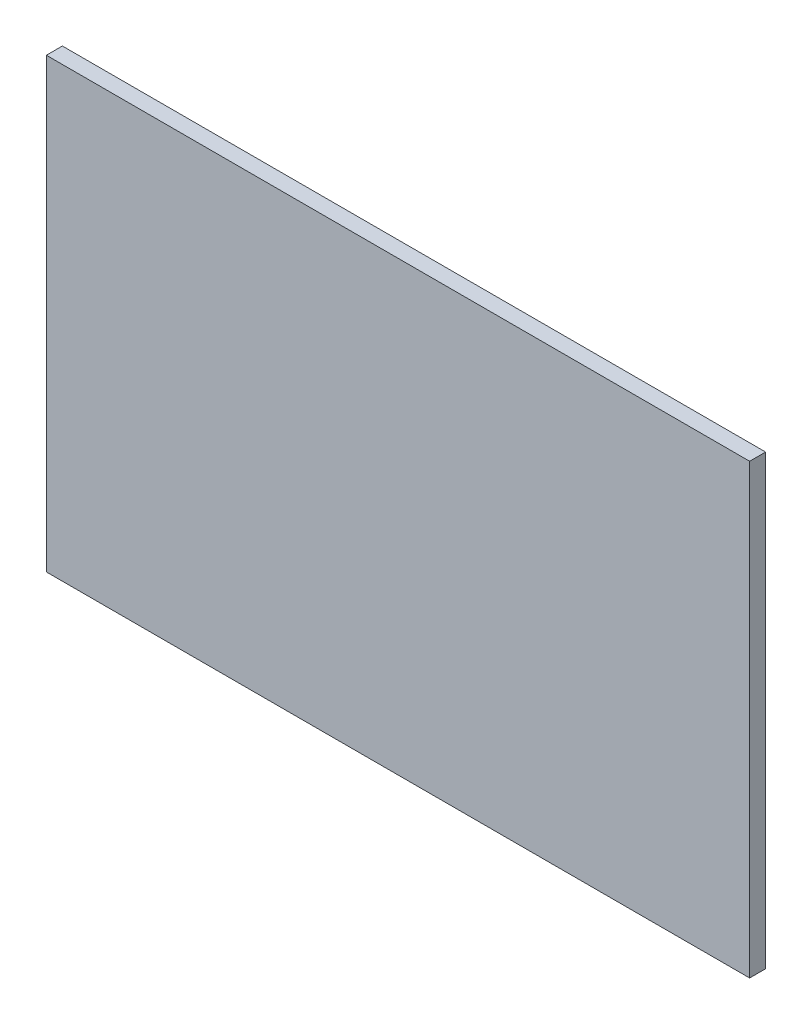
ISO-10303-21;
HEADER;
FILE_DESCRIPTION(('STEP AP214'),'2;1');
FILE_NAME('part.step','',(''),(''),'','','');
FILE_SCHEMA(('AUTOMOTIVE_DESIGN { 1 0 10303 214 1 1 1 1 }'));
ENDSEC;
DATA;
#1=APPLICATION_CONTEXT('core data for automotive mechanical design processes');
#2=APPLICATION_PROTOCOL_DEFINITION('international standard','automotive_design',2000,#1);
#3=PRODUCT_CONTEXT('',#1,'mechanical');
#4=PRODUCT('Part','Part','',(#3));
#5=PRODUCT_RELATED_PRODUCT_CATEGORY('part','',(#4));
#6=PRODUCT_DEFINITION_FORMATION('','',#4);
#7=PRODUCT_DEFINITION_CONTEXT('part definition',#1,'design');
#8=PRODUCT_DEFINITION('design','',#6,#7);
#9=PRODUCT_DEFINITION_SHAPE('','',#8);
#10=(LENGTH_UNIT() NAMED_UNIT(*) SI_UNIT(.MILLI.,.METRE.));
#11=(NAMED_UNIT(*) PLANE_ANGLE_UNIT() SI_UNIT($,.RADIAN.));
#12=(NAMED_UNIT(*) SI_UNIT($,.STERADIAN.) SOLID_ANGLE_UNIT());
#13=UNCERTAINTY_MEASURE_WITH_UNIT(LENGTH_MEASURE(1.E-05),#10,'distance_accuracy_value','');
#14=(GEOMETRIC_REPRESENTATION_CONTEXT(3) GLOBAL_UNCERTAINTY_ASSIGNED_CONTEXT((#13)) GLOBAL_UNIT_ASSIGNED_CONTEXT((#10,
#11,#12)) REPRESENTATION_CONTEXT('',''));
#15=CARTESIAN_POINT('',(0.,0.,0.));
#16=DIRECTION('',(0.,0.,1.));
#17=DIRECTION('',(1.,0.,0.));
#18=AXIS2_PLACEMENT_3D('',#15,#16,#17);
#19=CARTESIAN_POINT('',(110.,70.,5.));
#20=DIRECTION('',(-1.,0.,0.));
#21=DIRECTION('',(0.,0.,1.));
#22=AXIS2_PLACEMENT_3D('',#19,#20,#21);
#23=PLANE('',#22);
#24=DIRECTION('',(0.,1.,0.));
#25=VECTOR('',#24,1.);
#26=CARTESIAN_POINT('',(110.,70.,0.));
#27=LINE('',#26,#25);
#28=CARTESIAN_POINT('',(110.,-70.,0.));
#29=VERTEX_POINT('',#28);
#30=CARTESIAN_POINT('',(110.,70.,0.));
#31=VERTEX_POINT('',#30);
#32=EDGE_CURVE('E98',#29,#31,#27,.T.);
#33=ORIENTED_EDGE('',*,*,#32,.T.);
#34=DIRECTION('',(0.,0.,-1.));
#35=VECTOR('',#34,1.);
#36=CARTESIAN_POINT('',(110.,70.,5.));
#37=LINE('',#36,#35);
#38=CARTESIAN_POINT('',(110.,70.,5.));
#39=VERTEX_POINT('',#38);
#40=EDGE_CURVE('E11',#39,#31,#37,.T.);
#41=ORIENTED_EDGE('',*,*,#40,.F.);
#42=DIRECTION('',(0.,1.,0.));
#43=VECTOR('',#42,1.);
#44=CARTESIAN_POINT('',(110.,70.,5.));
#45=LINE('',#44,#43);
#46=CARTESIAN_POINT('',(110.,-70.,5.));
#47=VERTEX_POINT('',#46);
#48=EDGE_CURVE('E86',#47,#39,#45,.T.);
#49=ORIENTED_EDGE('',*,*,#48,.F.);
#50=DIRECTION('',(0.,0.,-1.));
#51=VECTOR('',#50,1.);
#52=CARTESIAN_POINT('',(110.,-70.,5.));
#53=LINE('',#52,#51);
#54=EDGE_CURVE('E94',#47,#29,#53,.T.);
#55=ORIENTED_EDGE('',*,*,#54,.T.);
#56=EDGE_LOOP('',(#33,#41,#49,#55));
#57=FACE_BOUND('',#56,.T.);
#58=ADVANCED_FACE('F35',(#57),#23,.F.);
#59=CARTESIAN_POINT('',(-110.,70.,5.));
#60=DIRECTION('',(0.,-1.,0.));
#61=DIRECTION('',(0.,0.,-1.));
#62=AXIS2_PLACEMENT_3D('',#59,#60,#61);
#63=PLANE('',#62);
#64=DIRECTION('',(-1.,0.,0.));
#65=VECTOR('',#64,1.);
#66=CARTESIAN_POINT('',(-110.,70.,0.));
#67=LINE('',#66,#65);
#68=CARTESIAN_POINT('',(-110.,70.,0.));
#69=VERTEX_POINT('',#68);
#70=EDGE_CURVE('E90',#31,#69,#67,.T.);
#71=ORIENTED_EDGE('',*,*,#70,.T.);
#72=DIRECTION('',(0.,0.,-1.));
#73=VECTOR('',#72,1.);
#74=CARTESIAN_POINT('',(-110.,70.,5.));
#75=LINE('',#74,#73);
#76=CARTESIAN_POINT('',(-110.,70.,5.));
#77=VERTEX_POINT('',#76);
#78=EDGE_CURVE('E43',#77,#69,#75,.T.);
#79=ORIENTED_EDGE('',*,*,#78,.F.);
#80=DIRECTION('',(-1.,0.,0.));
#81=VECTOR('',#80,1.);
#82=CARTESIAN_POINT('',(-110.,70.,5.));
#83=LINE('',#82,#81);
#84=EDGE_CURVE('E81',#39,#77,#83,.T.);
#85=ORIENTED_EDGE('',*,*,#84,.F.);
#86=ORIENTED_EDGE('',*,*,#40,.T.);
#87=EDGE_LOOP('',(#71,#79,#85,#86));
#88=FACE_BOUND('',#87,.T.);
#89=ADVANCED_FACE('F89',(#88),#63,.F.);
#90=CARTESIAN_POINT('',(-110.,70.,5.));
#91=DIRECTION('',(1.,0.,0.));
#92=DIRECTION('',(0.,1.,0.));
#93=AXIS2_PLACEMENT_3D('',#90,#91,#92);
#94=PLANE('',#93);
#95=DIRECTION('',(0.,-1.,0.));
#96=VECTOR('',#95,1.);
#97=CARTESIAN_POINT('',(-110.,70.,0.));
#98=LINE('',#97,#96);
#99=CARTESIAN_POINT('',(-110.,-70.,0.));
#100=VERTEX_POINT('',#99);
#101=EDGE_CURVE('E68',#69,#100,#98,.T.);
#102=ORIENTED_EDGE('',*,*,#101,.T.);
#103=DIRECTION('',(0.,0.,-1.));
#104=VECTOR('',#103,1.);
#105=CARTESIAN_POINT('',(-110.,-70.,5.));
#106=LINE('',#105,#104);
#107=CARTESIAN_POINT('',(-110.,-70.,5.));
#108=VERTEX_POINT('',#107);
#109=EDGE_CURVE('E91',#108,#100,#106,.T.);
#110=ORIENTED_EDGE('',*,*,#109,.F.);
#111=DIRECTION('',(0.,-1.,0.));
#112=VECTOR('',#111,1.);
#113=CARTESIAN_POINT('',(-110.,70.,5.));
#114=LINE('',#113,#112);
#115=EDGE_CURVE('E84',#77,#108,#114,.T.);
#116=ORIENTED_EDGE('',*,*,#115,.F.);
#117=ORIENTED_EDGE('',*,*,#78,.T.);
#118=EDGE_LOOP('',(#102,#110,#116,#117));
#119=FACE_BOUND('',#118,.T.);
#120=ADVANCED_FACE('F92',(#119),#94,.F.);
#121=CARTESIAN_POINT('',(-110.,-70.,5.));
#122=DIRECTION('',(0.,1.,0.));
#123=DIRECTION('',(0.,0.,1.));
#124=AXIS2_PLACEMENT_3D('',#121,#122,#123);
#125=PLANE('',#124);
#126=DIRECTION('',(1.,0.,0.));
#127=VECTOR('',#126,1.);
#128=CARTESIAN_POINT('',(-110.,-70.,0.));
#129=LINE('',#128,#127);
#130=EDGE_CURVE('E74',#100,#29,#129,.T.);
#131=ORIENTED_EDGE('',*,*,#130,.T.);
#132=ORIENTED_EDGE('',*,*,#54,.F.);
#133=DIRECTION('',(1.,0.,0.));
#134=VECTOR('',#133,1.);
#135=CARTESIAN_POINT('',(-110.,-70.,5.));
#136=LINE('',#135,#134);
#137=EDGE_CURVE('E51',#108,#47,#136,.T.);
#138=ORIENTED_EDGE('',*,*,#137,.F.);
#139=ORIENTED_EDGE('',*,*,#109,.T.);
#140=EDGE_LOOP('',(#131,#132,#138,#139));
#141=FACE_BOUND('',#140,.T.);
#142=ADVANCED_FACE('F105',(#141),#125,.F.);
#143=CARTESIAN_POINT('',(0.,0.,5.));
#144=DIRECTION('',(0.,0.,1.));
#145=DIRECTION('',(1.,0.,0.));
#146=AXIS2_PLACEMENT_3D('',#143,#144,#145);
#147=PLANE('',#146);
#148=ORIENTED_EDGE('',*,*,#48,.T.);
#149=ORIENTED_EDGE('',*,*,#84,.T.);
#150=ORIENTED_EDGE('',*,*,#115,.T.);
#151=ORIENTED_EDGE('',*,*,#137,.T.);
#152=EDGE_LOOP('',(#148,#149,#150,#151));
#153=FACE_BOUND('',#152,.T.);
#154=ADVANCED_FACE('F82',(#153),#147,.T.);
#155=CARTESIAN_POINT('',(0.,0.,0.));
#156=DIRECTION('',(0.,0.,1.));
#157=DIRECTION('',(1.,0.,0.));
#158=AXIS2_PLACEMENT_3D('',#155,#156,#157);
#159=PLANE('',#158);
#160=ORIENTED_EDGE('',*,*,#32,.F.);
#161=ORIENTED_EDGE('',*,*,#130,.F.);
#162=ORIENTED_EDGE('',*,*,#101,.F.);
#163=ORIENTED_EDGE('',*,*,#70,.F.);
#164=EDGE_LOOP('',(#160,#161,#162,#163));
#165=FACE_BOUND('',#164,.T.);
#166=ADVANCED_FACE('F108',(#165),#159,.F.);
#167=CLOSED_SHELL('',(#58,#89,#120,#142,#154,#166));
#168=MANIFOLD_SOLID_BREP('B2',#167);
#169=ADVANCED_BREP_SHAPE_REPRESENTATION('',(#18,#168),#14);
#170=SHAPE_DEFINITION_REPRESENTATION(#9,#169);
ENDSEC;
END-ISO-10303-21;
